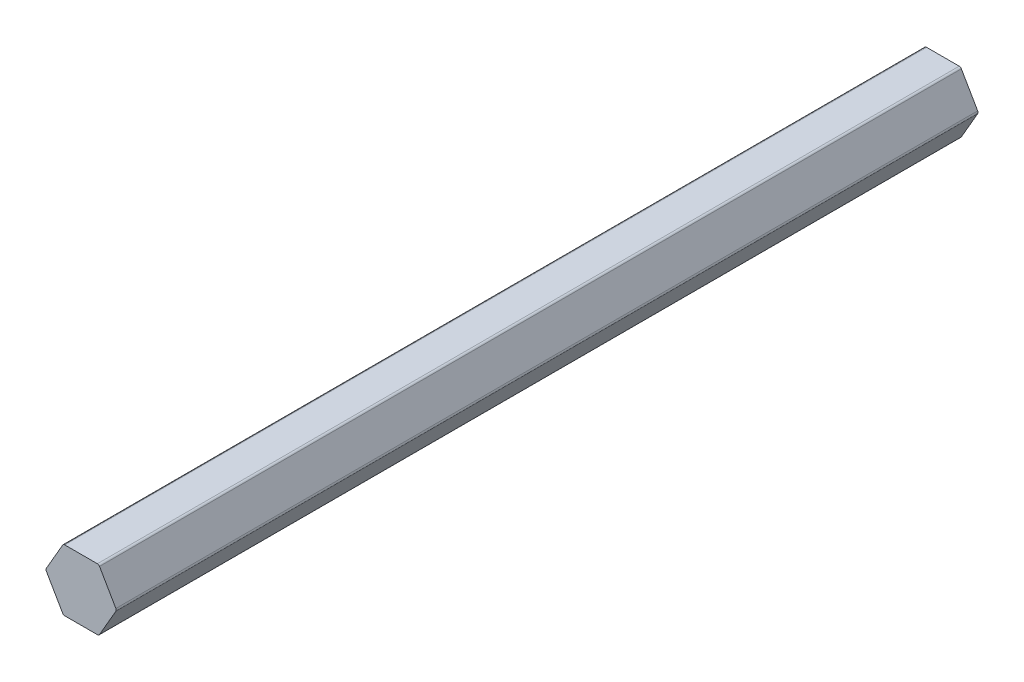
ISO-10303-21;
HEADER;
FILE_DESCRIPTION(('STEP AP214'),'2;1');
FILE_NAME('part.step','',(''),(''),'','','');
FILE_SCHEMA(('AUTOMOTIVE_DESIGN { 1 0 10303 214 1 1 1 1 }'));
ENDSEC;
DATA;
#1=APPLICATION_CONTEXT('core data for automotive mechanical design processes');
#2=APPLICATION_PROTOCOL_DEFINITION('international standard','automotive_design',2000,#1);
#3=PRODUCT_CONTEXT('',#1,'mechanical');
#4=PRODUCT('Part','Part','',(#3));
#5=PRODUCT_RELATED_PRODUCT_CATEGORY('part','',(#4));
#6=PRODUCT_DEFINITION_FORMATION('','',#4);
#7=PRODUCT_DEFINITION_CONTEXT('part definition',#1,'design');
#8=PRODUCT_DEFINITION('design','',#6,#7);
#9=PRODUCT_DEFINITION_SHAPE('','',#8);
#10=(LENGTH_UNIT() NAMED_UNIT(*) SI_UNIT(.MILLI.,.METRE.));
#11=(NAMED_UNIT(*) PLANE_ANGLE_UNIT() SI_UNIT($,.RADIAN.));
#12=(NAMED_UNIT(*) SI_UNIT($,.STERADIAN.) SOLID_ANGLE_UNIT());
#13=UNCERTAINTY_MEASURE_WITH_UNIT(LENGTH_MEASURE(1.E-05),#10,'distance_accuracy_value','');
#14=(GEOMETRIC_REPRESENTATION_CONTEXT(3) GLOBAL_UNCERTAINTY_ASSIGNED_CONTEXT((#13)) GLOBAL_UNIT_ASSIGNED_CONTEXT((#10,
#11,#12)) REPRESENTATION_CONTEXT('',''));
#15=CARTESIAN_POINT('',(0.,0.,0.));
#16=DIRECTION('',(0.,0.,1.));
#17=DIRECTION('',(1.,0.,0.));
#18=AXIS2_PLACEMENT_3D('',#15,#16,#17);
#19=CARTESIAN_POINT('',(-6.73109584837417,0.,88.9));
#20=DIRECTION('',(0.,0.,-1.));
#21=DIRECTION('',(-1.,0.,0.));
#22=AXIS2_PLACEMENT_3D('',#19,#20,#21);
#23=CYLINDRICAL_SURFACE('',#22,0.507999999999996);
#24=CARTESIAN_POINT('',(-6.73109584837417,0.,-88.9));
#25=DIRECTION('',(0.,0.,1.));
#26=DIRECTION('',(1.,0.,0.));
#27=AXIS2_PLACEMENT_3D('',#24,#25,#26);
#28=CIRCLE('',#27,0.507999999999996);
#29=CARTESIAN_POINT('',(-7.17103675349666,0.253999999999996,-88.9));
#30=VERTEX_POINT('',#29);
#31=CARTESIAN_POINT('',(-7.17103675349666,-0.254000000000004,-88.9));
#32=VERTEX_POINT('',#31);
#33=EDGE_CURVE('E152',#30,#32,#28,.T.);
#34=ORIENTED_EDGE('',*,*,#33,.T.);
#35=DIRECTION('',(0.,0.,-1.));
#36=VECTOR('',#35,1.);
#37=CARTESIAN_POINT('',(-7.17103675349666,-0.254000000000004,88.9));
#38=LINE('',#37,#36);
#39=CARTESIAN_POINT('',(-7.17103675349666,-0.254000000000004,88.9));
#40=VERTEX_POINT('',#39);
#41=EDGE_CURVE('E11',#40,#32,#38,.T.);
#42=ORIENTED_EDGE('',*,*,#41,.F.);
#43=CARTESIAN_POINT('',(-6.73109584837417,0.,88.9));
#44=DIRECTION('',(0.,0.,1.));
#45=DIRECTION('',(1.,0.,0.));
#46=AXIS2_PLACEMENT_3D('',#43,#44,#45);
#47=CIRCLE('',#46,0.507999999999996);
#48=CARTESIAN_POINT('',(-7.17103675349666,0.253999999999996,88.9));
#49=VERTEX_POINT('',#48);
#50=EDGE_CURVE('E174',#49,#40,#47,.T.);
#51=ORIENTED_EDGE('',*,*,#50,.F.);
#52=DIRECTION('',(0.,0.,-1.));
#53=VECTOR('',#52,1.);
#54=CARTESIAN_POINT('',(-7.17103675349666,0.253999999999996,88.9));
#55=LINE('',#54,#53);
#56=EDGE_CURVE('E148',#49,#30,#55,.T.);
#57=ORIENTED_EDGE('',*,*,#56,.T.);
#58=EDGE_LOOP('',(#34,#42,#51,#57));
#59=FACE_BOUND('',#58,.T.);
#60=ADVANCED_FACE('F32',(#59),#23,.T.);
#61=CARTESIAN_POINT('',(-7.17103675349666,-0.254000000000004,88.9));
#62=DIRECTION('',(0.866025403784438,0.5,0.));
#63=DIRECTION('',(-0.5,0.866025403784438,0.));
#64=AXIS2_PLACEMENT_3D('',#61,#62,#63);
#65=PLANE('',#64);
#66=DIRECTION('',(0.5,-0.866025403784438,0.));
#67=VECTOR('',#66,1.);
#68=CARTESIAN_POINT('',(-7.17103675349666,-0.254000000000004,-88.9));
#69=LINE('',#68,#67);
#70=CARTESIAN_POINT('',(-3.80548882930957,-6.0833,-88.9));
#71=VERTEX_POINT('',#70);
#72=EDGE_CURVE('E155',#32,#71,#69,.T.);
#73=ORIENTED_EDGE('',*,*,#72,.T.);
#74=DIRECTION('',(0.,0.,-1.));
#75=VECTOR('',#74,1.);
#76=CARTESIAN_POINT('',(-3.80548882930957,-6.0833,88.9));
#77=LINE('',#76,#75);
#78=CARTESIAN_POINT('',(-3.80548882930957,-6.0833,88.9));
#79=VERTEX_POINT('',#78);
#80=EDGE_CURVE('E40',#79,#71,#77,.T.);
#81=ORIENTED_EDGE('',*,*,#80,.F.);
#82=DIRECTION('',(0.5,-0.866025403784438,0.));
#83=VECTOR('',#82,1.);
#84=CARTESIAN_POINT('',(-7.17103675349666,-0.254000000000004,88.9));
#85=LINE('',#84,#83);
#86=EDGE_CURVE('E103',#40,#79,#85,.T.);
#87=ORIENTED_EDGE('',*,*,#86,.F.);
#88=ORIENTED_EDGE('',*,*,#41,.T.);
#89=EDGE_LOOP('',(#73,#81,#87,#88));
#90=FACE_BOUND('',#89,.T.);
#91=ADVANCED_FACE('F252',(#90),#65,.F.);
#92=CARTESIAN_POINT('',(-3.36554792418708,-5.8293,88.9));
#93=DIRECTION('',(0.,0.,-1.));
#94=DIRECTION('',(-1.,0.,0.));
#95=AXIS2_PLACEMENT_3D('',#92,#93,#94);
#96=CYLINDRICAL_SURFACE('',#95,0.508000000000003);
#97=CARTESIAN_POINT('',(-3.36554792418708,-5.8293,-88.9));
#98=DIRECTION('',(0.,0.,1.));
#99=DIRECTION('',(1.,0.,0.));
#100=AXIS2_PLACEMENT_3D('',#97,#98,#99);
#101=CIRCLE('',#100,0.508000000000003);
#102=CARTESIAN_POINT('',(-3.36554792418708,-6.3373,-88.9));
#103=VERTEX_POINT('',#102);
#104=EDGE_CURVE('E157',#71,#103,#101,.T.);
#105=ORIENTED_EDGE('',*,*,#104,.T.);
#106=DIRECTION('',(0.,0.,-1.));
#107=VECTOR('',#106,1.);
#108=CARTESIAN_POINT('',(-3.36554792418708,-6.3373,88.9));
#109=LINE('',#108,#107);
#110=CARTESIAN_POINT('',(-3.36554792418708,-6.3373,88.9));
#111=VERTEX_POINT('',#110);
#112=EDGE_CURVE('E193',#111,#103,#109,.T.);
#113=ORIENTED_EDGE('',*,*,#112,.F.);
#114=CARTESIAN_POINT('',(-3.36554792418708,-5.8293,88.9));
#115=DIRECTION('',(0.,0.,1.));
#116=DIRECTION('',(1.,0.,0.));
#117=AXIS2_PLACEMENT_3D('',#114,#115,#116);
#118=CIRCLE('',#117,0.508000000000003);
#119=EDGE_CURVE('E201',#79,#111,#118,.T.);
#120=ORIENTED_EDGE('',*,*,#119,.F.);
#121=ORIENTED_EDGE('',*,*,#80,.T.);
#122=EDGE_LOOP('',(#105,#113,#120,#121));
#123=FACE_BOUND('',#122,.T.);
#124=ADVANCED_FACE('F199',(#123),#96,.T.);
#125=CARTESIAN_POINT('',(-3.36554792418708,-6.3373,88.9));
#126=DIRECTION('',(0.,1.,0.));
#127=DIRECTION('',(-1.,0.,0.));
#128=AXIS2_PLACEMENT_3D('',#125,#126,#127);
#129=PLANE('',#128);
#130=DIRECTION('',(1.,0.,0.));
#131=VECTOR('',#130,1.);
#132=CARTESIAN_POINT('',(-3.36554792418708,-6.3373,-88.9));
#133=LINE('',#132,#131);
#134=CARTESIAN_POINT('',(3.36554792418709,-6.3373,-88.9));
#135=VERTEX_POINT('',#134);
#136=EDGE_CURVE('E159',#103,#135,#133,.T.);
#137=ORIENTED_EDGE('',*,*,#136,.T.);
#138=DIRECTION('',(0.,0.,-1.));
#139=VECTOR('',#138,1.);
#140=CARTESIAN_POINT('',(3.36554792418709,-6.3373,88.9));
#141=LINE('',#140,#139);
#142=CARTESIAN_POINT('',(3.36554792418709,-6.3373,88.9));
#143=VERTEX_POINT('',#142);
#144=EDGE_CURVE('E190',#143,#135,#141,.T.);
#145=ORIENTED_EDGE('',*,*,#144,.F.);
#146=DIRECTION('',(1.,0.,0.));
#147=VECTOR('',#146,1.);
#148=CARTESIAN_POINT('',(-3.36554792418708,-6.3373,88.9));
#149=LINE('',#148,#147);
#150=EDGE_CURVE('E219',#111,#143,#149,.T.);
#151=ORIENTED_EDGE('',*,*,#150,.F.);
#152=ORIENTED_EDGE('',*,*,#112,.T.);
#153=EDGE_LOOP('',(#137,#145,#151,#152));
#154=FACE_BOUND('',#153,.T.);
#155=ADVANCED_FACE('F210',(#154),#129,.F.);
#156=CARTESIAN_POINT('',(3.36554792418708,-5.8293,88.9));
#157=DIRECTION('',(0.,0.,-1.));
#158=DIRECTION('',(-1.,0.,0.));
#159=AXIS2_PLACEMENT_3D('',#156,#157,#158);
#160=CYLINDRICAL_SURFACE('',#159,0.508);
#161=CARTESIAN_POINT('',(3.36554792418708,-5.8293,-88.9));
#162=DIRECTION('',(0.,0.,1.));
#163=DIRECTION('',(1.,0.,0.));
#164=AXIS2_PLACEMENT_3D('',#161,#162,#163);
#165=CIRCLE('',#164,0.508);
#166=CARTESIAN_POINT('',(3.80548882930958,-6.0833,-88.9));
#167=VERTEX_POINT('',#166);
#168=EDGE_CURVE('E161',#135,#167,#165,.T.);
#169=ORIENTED_EDGE('',*,*,#168,.T.);
#170=DIRECTION('',(0.,0.,-1.));
#171=VECTOR('',#170,1.);
#172=CARTESIAN_POINT('',(3.80548882930958,-6.0833,88.9));
#173=LINE('',#172,#171);
#174=CARTESIAN_POINT('',(3.80548882930958,-6.0833,88.9));
#175=VERTEX_POINT('',#174);
#176=EDGE_CURVE('E187',#175,#167,#173,.T.);
#177=ORIENTED_EDGE('',*,*,#176,.F.);
#178=CARTESIAN_POINT('',(3.36554792418708,-5.8293,88.9));
#179=DIRECTION('',(0.,0.,1.));
#180=DIRECTION('',(1.,0.,0.));
#181=AXIS2_PLACEMENT_3D('',#178,#179,#180);
#182=CIRCLE('',#181,0.508);
#183=EDGE_CURVE('E216',#143,#175,#182,.T.);
#184=ORIENTED_EDGE('',*,*,#183,.F.);
#185=ORIENTED_EDGE('',*,*,#144,.T.);
#186=EDGE_LOOP('',(#169,#177,#184,#185));
#187=FACE_BOUND('',#186,.T.);
#188=ADVANCED_FACE('F214',(#187),#160,.T.);
#189=CARTESIAN_POINT('',(3.80548882930958,-6.0833,88.9));
#190=DIRECTION('',(-0.866025403784439,0.5,0.));
#191=DIRECTION('',(-0.5,-0.866025403784439,0.));
#192=AXIS2_PLACEMENT_3D('',#189,#190,#191);
#193=PLANE('',#192);
#194=DIRECTION('',(0.499999999999999,0.866025403784439,0.));
#195=VECTOR('',#194,1.);
#196=CARTESIAN_POINT('',(3.80548882930958,-6.0833,-88.9));
#197=LINE('',#196,#195);
#198=CARTESIAN_POINT('',(7.17103675349666,-0.254,-88.9));
#199=VERTEX_POINT('',#198);
#200=EDGE_CURVE('E163',#167,#199,#197,.T.);
#201=ORIENTED_EDGE('',*,*,#200,.T.);
#202=DIRECTION('',(0.,0.,-1.));
#203=VECTOR('',#202,1.);
#204=CARTESIAN_POINT('',(7.17103675349666,-0.254,88.9));
#205=LINE('',#204,#203);
#206=CARTESIAN_POINT('',(7.17103675349666,-0.254,88.9));
#207=VERTEX_POINT('',#206);
#208=EDGE_CURVE('E184',#207,#199,#205,.T.);
#209=ORIENTED_EDGE('',*,*,#208,.F.);
#210=DIRECTION('',(0.499999999999999,0.866025403784439,0.));
#211=VECTOR('',#210,1.);
#212=CARTESIAN_POINT('',(3.80548882930958,-6.0833,88.9));
#213=LINE('',#212,#211);
#214=EDGE_CURVE('E218',#175,#207,#213,.T.);
#215=ORIENTED_EDGE('',*,*,#214,.F.);
#216=ORIENTED_EDGE('',*,*,#176,.T.);
#217=EDGE_LOOP('',(#201,#209,#215,#216));
#218=FACE_BOUND('',#217,.T.);
#219=ADVANCED_FACE('F265',(#218),#193,.F.);
#220=CARTESIAN_POINT('',(6.73109584837417,0.,88.9));
#221=DIRECTION('',(0.,0.,-1.));
#222=DIRECTION('',(-1.,0.,0.));
#223=AXIS2_PLACEMENT_3D('',#220,#221,#222);
#224=CYLINDRICAL_SURFACE('',#223,0.507999999999995);
#225=CARTESIAN_POINT('',(6.73109584837417,0.,-88.9));
#226=DIRECTION('',(0.,0.,1.));
#227=DIRECTION('',(1.,0.,0.));
#228=AXIS2_PLACEMENT_3D('',#225,#226,#227);
#229=CIRCLE('',#228,0.507999999999995);
#230=CARTESIAN_POINT('',(7.17103675349666,0.254000000000004,-88.9));
#231=VERTEX_POINT('',#230);
#232=EDGE_CURVE('E165',#199,#231,#229,.T.);
#233=ORIENTED_EDGE('',*,*,#232,.T.);
#234=DIRECTION('',(0.,0.,-1.));
#235=VECTOR('',#234,1.);
#236=CARTESIAN_POINT('',(7.17103675349666,0.254000000000004,88.9));
#237=LINE('',#236,#235);
#238=CARTESIAN_POINT('',(7.17103675349666,0.254000000000004,88.9));
#239=VERTEX_POINT('',#238);
#240=EDGE_CURVE('E181',#239,#231,#237,.T.);
#241=ORIENTED_EDGE('',*,*,#240,.F.);
#242=CARTESIAN_POINT('',(6.73109584837417,0.,88.9));
#243=DIRECTION('',(0.,0.,1.));
#244=DIRECTION('',(1.,0.,0.));
#245=AXIS2_PLACEMENT_3D('',#242,#243,#244);
#246=CIRCLE('',#245,0.507999999999995);
#247=EDGE_CURVE('E221',#207,#239,#246,.T.);
#248=ORIENTED_EDGE('',*,*,#247,.F.);
#249=ORIENTED_EDGE('',*,*,#208,.T.);
#250=EDGE_LOOP('',(#233,#241,#248,#249));
#251=FACE_BOUND('',#250,.T.);
#252=ADVANCED_FACE('F268',(#251),#224,.T.);
#253=CARTESIAN_POINT('',(7.17103675349666,0.254000000000003,88.9));
#254=DIRECTION('',(-0.866025403784438,-0.5,0.));
#255=DIRECTION('',(0.5,-0.866025403784438,0.));
#256=AXIS2_PLACEMENT_3D('',#253,#254,#255);
#257=PLANE('',#256);
#258=DIRECTION('',(-0.5,0.866025403784438,0.));
#259=VECTOR('',#258,1.);
#260=CARTESIAN_POINT('',(7.17103675349666,0.254000000000003,-88.9));
#261=LINE('',#260,#259);
#262=CARTESIAN_POINT('',(3.80548882930957,6.0833,-88.9));
#263=VERTEX_POINT('',#262);
#264=EDGE_CURVE('E167',#231,#263,#261,.T.);
#265=ORIENTED_EDGE('',*,*,#264,.T.);
#266=DIRECTION('',(0.,0.,-1.));
#267=VECTOR('',#266,1.);
#268=CARTESIAN_POINT('',(3.80548882930957,6.0833,88.9));
#269=LINE('',#268,#267);
#270=CARTESIAN_POINT('',(3.80548882930957,6.0833,88.9));
#271=VERTEX_POINT('',#270);
#272=EDGE_CURVE('E178',#271,#263,#269,.T.);
#273=ORIENTED_EDGE('',*,*,#272,.F.);
#274=DIRECTION('',(-0.5,0.866025403784438,0.));
#275=VECTOR('',#274,1.);
#276=CARTESIAN_POINT('',(7.17103675349666,0.254000000000003,88.9));
#277=LINE('',#276,#275);
#278=EDGE_CURVE('E227',#239,#271,#277,.T.);
#279=ORIENTED_EDGE('',*,*,#278,.F.);
#280=ORIENTED_EDGE('',*,*,#240,.T.);
#281=EDGE_LOOP('',(#265,#273,#279,#280));
#282=FACE_BOUND('',#281,.T.);
#283=ADVANCED_FACE('F233',(#282),#257,.F.);
#284=CARTESIAN_POINT('',(3.36554792418708,5.8293,88.9));
#285=DIRECTION('',(0.,0.,-1.));
#286=DIRECTION('',(-1.,0.,0.));
#287=AXIS2_PLACEMENT_3D('',#284,#285,#286);
#288=CYLINDRICAL_SURFACE('',#287,0.507999999999997);
#289=CARTESIAN_POINT('',(3.36554792418708,5.8293,-88.9));
#290=DIRECTION('',(0.,0.,1.));
#291=DIRECTION('',(1.,0.,0.));
#292=AXIS2_PLACEMENT_3D('',#289,#290,#291);
#293=CIRCLE('',#292,0.507999999999997);
#294=CARTESIAN_POINT('',(3.36554792418709,6.3373,-88.9));
#295=VERTEX_POINT('',#294);
#296=EDGE_CURVE('E169',#263,#295,#293,.T.);
#297=ORIENTED_EDGE('',*,*,#296,.T.);
#298=DIRECTION('',(0.,0.,-1.));
#299=VECTOR('',#298,1.);
#300=CARTESIAN_POINT('',(3.36554792418709,6.3373,88.9));
#301=LINE('',#300,#299);
#302=CARTESIAN_POINT('',(3.36554792418709,6.3373,88.9));
#303=VERTEX_POINT('',#302);
#304=EDGE_CURVE('E143',#303,#295,#301,.T.);
#305=ORIENTED_EDGE('',*,*,#304,.F.);
#306=CARTESIAN_POINT('',(3.36554792418708,5.8293,88.9));
#307=DIRECTION('',(0.,0.,1.));
#308=DIRECTION('',(1.,0.,0.));
#309=AXIS2_PLACEMENT_3D('',#306,#307,#308);
#310=CIRCLE('',#309,0.507999999999997);
#311=EDGE_CURVE('E134',#271,#303,#310,.T.);
#312=ORIENTED_EDGE('',*,*,#311,.F.);
#313=ORIENTED_EDGE('',*,*,#272,.T.);
#314=EDGE_LOOP('',(#297,#305,#312,#313));
#315=FACE_BOUND('',#314,.T.);
#316=ADVANCED_FACE('F237',(#315),#288,.T.);
#317=CARTESIAN_POINT('',(3.36554792418709,6.3373,88.9));
#318=DIRECTION('',(0.,-1.,0.));
#319=DIRECTION('',(1.,0.,0.));
#320=AXIS2_PLACEMENT_3D('',#317,#318,#319);
#321=PLANE('',#320);
#322=DIRECTION('',(-1.,0.,0.));
#323=VECTOR('',#322,1.);
#324=CARTESIAN_POINT('',(3.36554792418709,6.3373,-88.9));
#325=LINE('',#324,#323);
#326=CARTESIAN_POINT('',(-3.36554792418708,6.3373,-88.9));
#327=VERTEX_POINT('',#326);
#328=EDGE_CURVE('E142',#295,#327,#325,.T.);
#329=ORIENTED_EDGE('',*,*,#328,.T.);
#330=DIRECTION('',(0.,0.,-1.));
#331=VECTOR('',#330,1.);
#332=CARTESIAN_POINT('',(-3.36554792418708,6.3373,88.9));
#333=LINE('',#332,#331);
#334=CARTESIAN_POINT('',(-3.36554792418708,6.3373,88.9));
#335=VERTEX_POINT('',#334);
#336=EDGE_CURVE('E139',#335,#327,#333,.T.);
#337=ORIENTED_EDGE('',*,*,#336,.F.);
#338=DIRECTION('',(-1.,0.,0.));
#339=VECTOR('',#338,1.);
#340=CARTESIAN_POINT('',(3.36554792418709,6.3373,88.9));
#341=LINE('',#340,#339);
#342=EDGE_CURVE('E128',#303,#335,#341,.T.);
#343=ORIENTED_EDGE('',*,*,#342,.F.);
#344=ORIENTED_EDGE('',*,*,#304,.T.);
#345=EDGE_LOOP('',(#329,#337,#343,#344));
#346=FACE_BOUND('',#345,.T.);
#347=ADVANCED_FACE('F140',(#346),#321,.F.);
#348=CARTESIAN_POINT('',(-3.36554792418709,5.8293,88.9));
#349=DIRECTION('',(0.,0.,-1.));
#350=DIRECTION('',(-1.,0.,0.));
#351=AXIS2_PLACEMENT_3D('',#348,#349,#350);
#352=CYLINDRICAL_SURFACE('',#351,0.508);
#353=CARTESIAN_POINT('',(-3.36554792418709,5.8293,-88.9));
#354=DIRECTION('',(0.,0.,1.));
#355=DIRECTION('',(1.,0.,0.));
#356=AXIS2_PLACEMENT_3D('',#353,#354,#355);
#357=CIRCLE('',#356,0.508);
#358=CARTESIAN_POINT('',(-3.80548882930958,6.0833,-88.9));
#359=VERTEX_POINT('',#358);
#360=EDGE_CURVE('E89',#327,#359,#357,.T.);
#361=ORIENTED_EDGE('',*,*,#360,.T.);
#362=DIRECTION('',(0.,0.,-1.));
#363=VECTOR('',#362,1.);
#364=CARTESIAN_POINT('',(-3.80548882930958,6.0833,88.9));
#365=LINE('',#364,#363);
#366=CARTESIAN_POINT('',(-3.80548882930958,6.0833,88.9));
#367=VERTEX_POINT('',#366);
#368=EDGE_CURVE('E144',#367,#359,#365,.T.);
#369=ORIENTED_EDGE('',*,*,#368,.F.);
#370=CARTESIAN_POINT('',(-3.36554792418709,5.8293,88.9));
#371=DIRECTION('',(0.,0.,1.));
#372=DIRECTION('',(1.,0.,0.));
#373=AXIS2_PLACEMENT_3D('',#370,#371,#372);
#374=CIRCLE('',#373,0.508);
#375=EDGE_CURVE('E132',#335,#367,#374,.T.);
#376=ORIENTED_EDGE('',*,*,#375,.F.);
#377=ORIENTED_EDGE('',*,*,#336,.T.);
#378=EDGE_LOOP('',(#361,#369,#376,#377));
#379=FACE_BOUND('',#378,.T.);
#380=ADVANCED_FACE('F146',(#379),#352,.T.);
#381=CARTESIAN_POINT('',(-3.80548882930958,6.0833,88.9));
#382=DIRECTION('',(0.866025403784439,-0.499999999999999,0.));
#383=DIRECTION('',(0.499999999999999,0.866025403784439,0.));
#384=AXIS2_PLACEMENT_3D('',#381,#382,#383);
#385=PLANE('',#384);
#386=DIRECTION('',(-0.499999999999999,-0.866025403784439,0.));
#387=VECTOR('',#386,1.);
#388=CARTESIAN_POINT('',(-3.80548882930958,6.0833,-88.9));
#389=LINE('',#388,#387);
#390=EDGE_CURVE('E95',#359,#30,#389,.T.);
#391=ORIENTED_EDGE('',*,*,#390,.T.);
#392=ORIENTED_EDGE('',*,*,#56,.F.);
#393=DIRECTION('',(-0.499999999999999,-0.866025403784439,0.));
#394=VECTOR('',#393,1.);
#395=CARTESIAN_POINT('',(-3.80548882930958,6.0833,88.9));
#396=LINE('',#395,#394);
#397=EDGE_CURVE('E48',#367,#49,#396,.T.);
#398=ORIENTED_EDGE('',*,*,#397,.F.);
#399=ORIENTED_EDGE('',*,*,#368,.T.);
#400=EDGE_LOOP('',(#391,#392,#398,#399));
#401=FACE_BOUND('',#400,.T.);
#402=ADVANCED_FACE('F241',(#401),#385,.F.);
#403=CARTESIAN_POINT('',(-6.73109584837417,0.,88.9));
#404=DIRECTION('',(0.,0.,1.));
#405=DIRECTION('',(1.,0.,0.));
#406=AXIS2_PLACEMENT_3D('',#403,#404,#405);
#407=PLANE('',#406);
#408=ORIENTED_EDGE('',*,*,#50,.T.);
#409=ORIENTED_EDGE('',*,*,#86,.T.);
#410=ORIENTED_EDGE('',*,*,#119,.T.);
#411=ORIENTED_EDGE('',*,*,#150,.T.);
#412=ORIENTED_EDGE('',*,*,#183,.T.);
#413=ORIENTED_EDGE('',*,*,#214,.T.);
#414=ORIENTED_EDGE('',*,*,#247,.T.);
#415=ORIENTED_EDGE('',*,*,#278,.T.);
#416=ORIENTED_EDGE('',*,*,#311,.T.);
#417=ORIENTED_EDGE('',*,*,#342,.T.);
#418=ORIENTED_EDGE('',*,*,#375,.T.);
#419=ORIENTED_EDGE('',*,*,#397,.T.);
#420=EDGE_LOOP('',(#408,#409,#410,#411,#412,#413,#414,#415,#416,#417,#418,#419));
#421=FACE_BOUND('',#420,.T.);
#422=ADVANCED_FACE('F130',(#421),#407,.T.);
#423=CARTESIAN_POINT('',(-6.73109584837417,0.,-88.9));
#424=DIRECTION('',(0.,0.,1.));
#425=DIRECTION('',(1.,0.,0.));
#426=AXIS2_PLACEMENT_3D('',#423,#424,#425);
#427=PLANE('',#426);
#428=ORIENTED_EDGE('',*,*,#33,.F.);
#429=ORIENTED_EDGE('',*,*,#390,.F.);
#430=ORIENTED_EDGE('',*,*,#360,.F.);
#431=ORIENTED_EDGE('',*,*,#328,.F.);
#432=ORIENTED_EDGE('',*,*,#296,.F.);
#433=ORIENTED_EDGE('',*,*,#264,.F.);
#434=ORIENTED_EDGE('',*,*,#232,.F.);
#435=ORIENTED_EDGE('',*,*,#200,.F.);
#436=ORIENTED_EDGE('',*,*,#168,.F.);
#437=ORIENTED_EDGE('',*,*,#136,.F.);
#438=ORIENTED_EDGE('',*,*,#104,.F.);
#439=ORIENTED_EDGE('',*,*,#72,.F.);
#440=EDGE_LOOP('',(#428,#429,#430,#431,#432,#433,#434,#435,#436,#437,#438,#439));
#441=FACE_BOUND('',#440,.T.);
#442=ADVANCED_FACE('F205',(#441),#427,.F.);
#443=CLOSED_SHELL('',(#60,#91,#124,#155,#188,#219,#252,#283,#316,#347,#380,#402,#422,#442));
#444=MANIFOLD_SOLID_BREP('B2',#443);
#445=ADVANCED_BREP_SHAPE_REPRESENTATION('',(#18,#444),#14);
#446=SHAPE_DEFINITION_REPRESENTATION(#9,#445);
ENDSEC;
END-ISO-10303-21;
